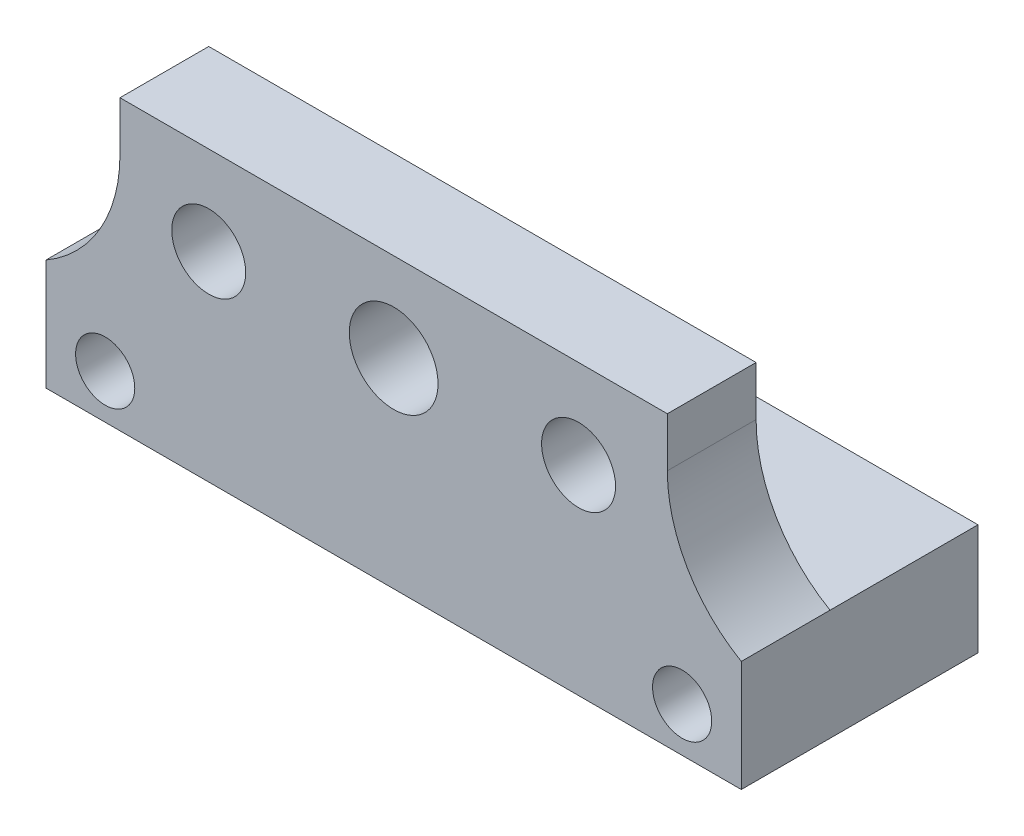
ISO-10303-21;
HEADER;
FILE_DESCRIPTION(('STEP AP214'),'2;1');
FILE_NAME('part.step','',(''),(''),'','','');
FILE_SCHEMA(('AUTOMOTIVE_DESIGN { 1 0 10303 214 1 1 1 1 }'));
ENDSEC;
DATA;
#1=APPLICATION_CONTEXT('core data for automotive mechanical design processes');
#2=APPLICATION_PROTOCOL_DEFINITION('international standard','automotive_design',2000,#1);
#3=PRODUCT_CONTEXT('',#1,'mechanical');
#4=PRODUCT('Part','Part','',(#3));
#5=PRODUCT_RELATED_PRODUCT_CATEGORY('part','',(#4));
#6=PRODUCT_DEFINITION_FORMATION('','',#4);
#7=PRODUCT_DEFINITION_CONTEXT('part definition',#1,'design');
#8=PRODUCT_DEFINITION('design','',#6,#7);
#9=PRODUCT_DEFINITION_SHAPE('','',#8);
#10=(LENGTH_UNIT() NAMED_UNIT(*) SI_UNIT(.MILLI.,.METRE.));
#11=(NAMED_UNIT(*) PLANE_ANGLE_UNIT() SI_UNIT($,.RADIAN.));
#12=(NAMED_UNIT(*) SI_UNIT($,.STERADIAN.) SOLID_ANGLE_UNIT());
#13=UNCERTAINTY_MEASURE_WITH_UNIT(LENGTH_MEASURE(1.E-05),#10,'distance_accuracy_value','');
#14=(GEOMETRIC_REPRESENTATION_CONTEXT(3) GLOBAL_UNCERTAINTY_ASSIGNED_CONTEXT((#13)) GLOBAL_UNIT_ASSIGNED_CONTEXT((#10,
#11,#12)) REPRESENTATION_CONTEXT('',''));
#15=CARTESIAN_POINT('',(0.,0.,0.));
#16=DIRECTION('',(0.,0.,1.));
#17=DIRECTION('',(1.,0.,0.));
#18=AXIS2_PLACEMENT_3D('',#15,#16,#17);
#19=CARTESIAN_POINT('',(0.,0.,0.));
#20=DIRECTION('',(0.,0.,1.));
#21=DIRECTION('',(1.,0.,0.));
#22=AXIS2_PLACEMENT_3D('',#19,#20,#21);
#23=PLANE('',#22);
#24=CARTESIAN_POINT('',(3.7,1.2,0.));
#25=DIRECTION('',(0.,0.,1.));
#26=DIRECTION('',(1.,0.,0.));
#27=AXIS2_PLACEMENT_3D('',#24,#25,#26);
#28=CIRCLE('',#27,0.599999999999999);
#29=CARTESIAN_POINT('',(4.3,1.2,0.));
#30=VERTEX_POINT('',#29);
#31=EDGE_CURVE('E322',#30,#30,#28,.T.);
#32=ORIENTED_EDGE('',*,*,#31,.T.);
#33=EDGE_LOOP('',(#32));
#34=FACE_BOUND('',#33,.T.);
#35=CARTESIAN_POINT('',(1.2,1.2,0.));
#36=DIRECTION('',(0.,0.,1.));
#37=DIRECTION('',(1.,0.,0.));
#38=AXIS2_PLACEMENT_3D('',#35,#36,#37);
#39=CIRCLE('',#38,0.3);
#40=CARTESIAN_POINT('',(1.5,1.2,0.));
#41=VERTEX_POINT('',#40);
#42=EDGE_CURVE('E162',#41,#41,#39,.T.);
#43=ORIENTED_EDGE('',*,*,#42,.T.);
#44=EDGE_LOOP('',(#43));
#45=FACE_BOUND('',#44,.T.);
#46=CARTESIAN_POINT('',(6.2,1.2,0.));
#47=DIRECTION('',(0.,0.,1.));
#48=DIRECTION('',(1.,0.,0.));
#49=AXIS2_PLACEMENT_3D('',#46,#47,#48);
#50=CIRCLE('',#49,0.3);
#51=CARTESIAN_POINT('',(6.5,1.2,0.));
#52=VERTEX_POINT('',#51);
#53=EDGE_CURVE('E150',#52,#52,#50,.T.);
#54=ORIENTED_EDGE('',*,*,#53,.T.);
#55=EDGE_LOOP('',(#54));
#56=FACE_BOUND('',#55,.T.);
#57=DIRECTION('',(1.,0.,0.));
#58=VECTOR('',#57,1.);
#59=CARTESIAN_POINT('',(8.4,0.,0.));
#60=LINE('',#59,#58);
#61=CARTESIAN_POINT('',(-0.999999999999996,0.,0.));
#62=VERTEX_POINT('',#61);
#63=CARTESIAN_POINT('',(8.4,0.,0.));
#64=VERTEX_POINT('',#63);
#65=EDGE_CURVE('E187',#62,#64,#60,.T.);
#66=ORIENTED_EDGE('',*,*,#65,.F.);
#67=CARTESIAN_POINT('',(-2.,1.73205080756887,0.));
#68=DIRECTION('',(0.,0.,1.));
#69=DIRECTION('',(1.,0.,0.));
#70=AXIS2_PLACEMENT_3D('',#67,#68,#69);
#71=CIRCLE('',#70,2.);
#72=CARTESIAN_POINT('',(0.,1.73205080756887,0.));
#73=VERTEX_POINT('',#72);
#74=EDGE_CURVE('E210',#62,#73,#71,.T.);
#75=ORIENTED_EDGE('',*,*,#74,.T.);
#76=DIRECTION('',(0.,-1.,0.));
#77=VECTOR('',#76,1.);
#78=CARTESIAN_POINT('',(0.,0.,0.));
#79=LINE('',#78,#77);
#80=CARTESIAN_POINT('',(0.,2.4,0.));
#81=VERTEX_POINT('',#80);
#82=EDGE_CURVE('E184',#81,#73,#79,.T.);
#83=ORIENTED_EDGE('',*,*,#82,.F.);
#84=DIRECTION('',(-1.,0.,0.));
#85=VECTOR('',#84,1.);
#86=CARTESIAN_POINT('',(0.,2.4,0.));
#87=LINE('',#86,#85);
#88=CARTESIAN_POINT('',(7.4,2.4,0.));
#89=VERTEX_POINT('',#88);
#90=EDGE_CURVE('E166',#89,#81,#87,.T.);
#91=ORIENTED_EDGE('',*,*,#90,.F.);
#92=DIRECTION('',(0.,1.,0.));
#93=VECTOR('',#92,1.);
#94=CARTESIAN_POINT('',(7.4,0.,0.));
#95=LINE('',#94,#93);
#96=CARTESIAN_POINT('',(7.4,1.73205080756888,0.));
#97=VERTEX_POINT('',#96);
#98=EDGE_CURVE('E170',#97,#89,#95,.T.);
#99=ORIENTED_EDGE('',*,*,#98,.F.);
#100=CARTESIAN_POINT('',(9.4,1.73205080756888,0.));
#101=DIRECTION('',(0.,0.,1.));
#102=DIRECTION('',(1.,0.,0.));
#103=AXIS2_PLACEMENT_3D('',#100,#101,#102);
#104=CIRCLE('',#103,2.);
#105=EDGE_CURVE('E11',#97,#64,#104,.T.);
#106=ORIENTED_EDGE('',*,*,#105,.T.);
#107=EDGE_LOOP('',(#66,#75,#83,#91,#99,#106));
#108=FACE_BOUND('',#107,.T.);
#109=ADVANCED_FACE('F36',(#34,#45,#56,#108),#23,.F.);
#110=CARTESIAN_POINT('',(0.,0.,0.));
#111=DIRECTION('',(-1.,0.,0.));
#112=DIRECTION('',(0.,-1.,0.));
#113=AXIS2_PLACEMENT_3D('',#110,#111,#112);
#114=PLANE('',#113);
#115=ORIENTED_EDGE('',*,*,#82,.T.);
#116=DIRECTION('',(0.,0.,1.));
#117=VECTOR('',#116,1.);
#118=CARTESIAN_POINT('',(0.,1.73205080756887,1.2));
#119=LINE('',#118,#117);
#120=CARTESIAN_POINT('',(0.,1.73205080756887,1.2));
#121=VERTEX_POINT('',#120);
#122=EDGE_CURVE('E200',#73,#121,#119,.T.);
#123=ORIENTED_EDGE('',*,*,#122,.T.);
#124=DIRECTION('',(0.,-1.,0.));
#125=VECTOR('',#124,1.);
#126=CARTESIAN_POINT('',(0.,0.,1.2));
#127=LINE('',#126,#125);
#128=CARTESIAN_POINT('',(0.,2.4,1.2));
#129=VERTEX_POINT('',#128);
#130=EDGE_CURVE('E165',#129,#121,#127,.T.);
#131=ORIENTED_EDGE('',*,*,#130,.F.);
#132=DIRECTION('',(0.,0.,1.));
#133=VECTOR('',#132,1.);
#134=CARTESIAN_POINT('',(0.,2.4,0.));
#135=LINE('',#134,#133);
#136=EDGE_CURVE('E185',#81,#129,#135,.T.);
#137=ORIENTED_EDGE('',*,*,#136,.F.);
#138=EDGE_LOOP('',(#115,#123,#131,#137));
#139=FACE_BOUND('',#138,.T.);
#140=ADVANCED_FACE('F222',(#139),#114,.T.);
#141=CARTESIAN_POINT('',(0.,2.4,0.));
#142=DIRECTION('',(0.,1.,0.));
#143=DIRECTION('',(0.,0.,1.));
#144=AXIS2_PLACEMENT_3D('',#141,#142,#143);
#145=PLANE('',#144);
#146=DIRECTION('',(-1.,0.,0.));
#147=VECTOR('',#146,1.);
#148=CARTESIAN_POINT('',(0.,2.4,1.2));
#149=LINE('',#148,#147);
#150=CARTESIAN_POINT('',(7.4,2.4,1.2));
#151=VERTEX_POINT('',#150);
#152=EDGE_CURVE('E181',#151,#129,#149,.T.);
#153=ORIENTED_EDGE('',*,*,#152,.F.);
#154=DIRECTION('',(0.,0.,1.));
#155=VECTOR('',#154,1.);
#156=CARTESIAN_POINT('',(7.4,2.4,0.));
#157=LINE('',#156,#155);
#158=EDGE_CURVE('E188',#89,#151,#157,.T.);
#159=ORIENTED_EDGE('',*,*,#158,.F.);
#160=ORIENTED_EDGE('',*,*,#90,.T.);
#161=ORIENTED_EDGE('',*,*,#136,.T.);
#162=EDGE_LOOP('',(#153,#159,#160,#161));
#163=FACE_BOUND('',#162,.T.);
#164=ADVANCED_FACE('F238',(#163),#145,.T.);
#165=CARTESIAN_POINT('',(7.4,0.,0.));
#166=DIRECTION('',(1.,0.,0.));
#167=DIRECTION('',(0.,0.,-1.));
#168=AXIS2_PLACEMENT_3D('',#165,#166,#167);
#169=PLANE('',#168);
#170=DIRECTION('',(0.,1.,0.));
#171=VECTOR('',#170,1.);
#172=CARTESIAN_POINT('',(7.4,0.,1.2));
#173=LINE('',#172,#171);
#174=CARTESIAN_POINT('',(7.4,1.73205080756888,1.2));
#175=VERTEX_POINT('',#174);
#176=EDGE_CURVE('E179',#175,#151,#173,.T.);
#177=ORIENTED_EDGE('',*,*,#176,.F.);
#178=DIRECTION('',(0.,0.,1.));
#179=VECTOR('',#178,1.);
#180=CARTESIAN_POINT('',(7.4,1.73205080756888,0.));
#181=LINE('',#180,#179);
#182=EDGE_CURVE('E51',#175,#97,#181,.F.);
#183=ORIENTED_EDGE('',*,*,#182,.T.);
#184=ORIENTED_EDGE('',*,*,#98,.T.);
#185=ORIENTED_EDGE('',*,*,#158,.T.);
#186=EDGE_LOOP('',(#177,#183,#184,#185));
#187=FACE_BOUND('',#186,.T.);
#188=ADVANCED_FACE('F235',(#187),#169,.T.);
#189=CARTESIAN_POINT('',(0.,0.,0.));
#190=DIRECTION('',(0.,-1.,0.));
#191=DIRECTION('',(1.,0.,0.));
#192=AXIS2_PLACEMENT_3D('',#189,#190,#191);
#193=PLANE('',#192);
#194=DIRECTION('',(0.,0.,1.));
#195=VECTOR('',#194,1.);
#196=CARTESIAN_POINT('',(-0.999999999999996,0.,0.));
#197=LINE('',#196,#195);
#198=CARTESIAN_POINT('',(-0.999999999999996,0.,-2.));
#199=VERTEX_POINT('',#198);
#200=EDGE_CURVE('E194',#199,#62,#197,.T.);
#201=ORIENTED_EDGE('',*,*,#200,.T.);
#202=ORIENTED_EDGE('',*,*,#65,.T.);
#203=DIRECTION('',(0.,0.,1.));
#204=VECTOR('',#203,1.);
#205=CARTESIAN_POINT('',(8.4,0.,0.));
#206=LINE('',#205,#204);
#207=CARTESIAN_POINT('',(8.4,0.,-2.));
#208=VERTEX_POINT('',#207);
#209=EDGE_CURVE('E191',#208,#64,#206,.T.);
#210=ORIENTED_EDGE('',*,*,#209,.F.);
#211=DIRECTION('',(1.,0.,0.));
#212=VECTOR('',#211,1.);
#213=CARTESIAN_POINT('',(8.4,0.,-2.));
#214=LINE('',#213,#212);
#215=EDGE_CURVE('E131',#199,#208,#214,.T.);
#216=ORIENTED_EDGE('',*,*,#215,.F.);
#217=EDGE_LOOP('',(#201,#202,#210,#216));
#218=FACE_BOUND('',#217,.T.);
#219=ADVANCED_FACE('F230',(#218),#193,.F.);
#220=CARTESIAN_POINT('',(8.4,0.,0.));
#221=DIRECTION('',(-1.,0.,0.));
#222=DIRECTION('',(0.,0.,1.));
#223=AXIS2_PLACEMENT_3D('',#220,#221,#222);
#224=PLANE('',#223);
#225=DIRECTION('',(0.,-1.,0.));
#226=VECTOR('',#225,1.);
#227=CARTESIAN_POINT('',(8.4,0.,1.2));
#228=LINE('',#227,#226);
#229=CARTESIAN_POINT('',(8.4,0.,1.2));
#230=VERTEX_POINT('',#229);
#231=CARTESIAN_POINT('',(8.4,-1.5,1.2));
#232=VERTEX_POINT('',#231);
#233=EDGE_CURVE('E113',#230,#232,#228,.T.);
#234=ORIENTED_EDGE('',*,*,#233,.T.);
#235=DIRECTION('',(0.,0.,1.));
#236=VECTOR('',#235,1.);
#237=CARTESIAN_POINT('',(8.4,-1.5,0.));
#238=LINE('',#237,#236);
#239=CARTESIAN_POINT('',(8.4,-1.5,-2.));
#240=VERTEX_POINT('',#239);
#241=EDGE_CURVE('E106',#240,#232,#238,.T.);
#242=ORIENTED_EDGE('',*,*,#241,.F.);
#243=DIRECTION('',(0.,-1.,0.));
#244=VECTOR('',#243,1.);
#245=CARTESIAN_POINT('',(8.4,0.,-2.));
#246=LINE('',#245,#244);
#247=EDGE_CURVE('E111',#208,#240,#246,.T.);
#248=ORIENTED_EDGE('',*,*,#247,.F.);
#249=ORIENTED_EDGE('',*,*,#209,.T.);
#250=EDGE_CURVE('E117',#64,#230,#206,.T.);
#251=ORIENTED_EDGE('',*,*,#250,.T.);
#252=EDGE_LOOP('',(#234,#242,#248,#249,#251));
#253=FACE_BOUND('',#252,.T.);
#254=ADVANCED_FACE('F108',(#253),#224,.F.);
#255=CARTESIAN_POINT('',(0.,-1.5,0.));
#256=DIRECTION('',(0.,-1.,0.));
#257=DIRECTION('',(1.,0.,0.));
#258=AXIS2_PLACEMENT_3D('',#255,#256,#257);
#259=PLANE('',#258);
#260=DIRECTION('',(1.,0.,0.));
#261=VECTOR('',#260,1.);
#262=CARTESIAN_POINT('',(0.,-1.5,1.2));
#263=LINE('',#262,#261);
#264=CARTESIAN_POINT('',(-0.999999999999996,-1.5,1.2));
#265=VERTEX_POINT('',#264);
#266=EDGE_CURVE('E176',#265,#232,#263,.T.);
#267=ORIENTED_EDGE('',*,*,#266,.F.);
#268=DIRECTION('',(0.,0.,1.));
#269=VECTOR('',#268,1.);
#270=CARTESIAN_POINT('',(-0.999999999999996,-1.5,0.));
#271=LINE('',#270,#269);
#272=CARTESIAN_POINT('',(-0.999999999999996,-1.5,-2.));
#273=VERTEX_POINT('',#272);
#274=EDGE_CURVE('E118',#273,#265,#271,.T.);
#275=ORIENTED_EDGE('',*,*,#274,.F.);
#276=DIRECTION('',(-1.,0.,0.));
#277=VECTOR('',#276,1.);
#278=CARTESIAN_POINT('',(8.4,-1.5,-2.));
#279=LINE('',#278,#277);
#280=EDGE_CURVE('E121',#240,#273,#279,.T.);
#281=ORIENTED_EDGE('',*,*,#280,.F.);
#282=ORIENTED_EDGE('',*,*,#241,.T.);
#283=EDGE_LOOP('',(#267,#275,#281,#282));
#284=FACE_BOUND('',#283,.T.);
#285=ADVANCED_FACE('F122',(#284),#259,.T.);
#286=CARTESIAN_POINT('',(-0.999999999999996,0.,0.));
#287=DIRECTION('',(-1.,0.,0.));
#288=DIRECTION('',(0.,-1.,0.));
#289=AXIS2_PLACEMENT_3D('',#286,#287,#288);
#290=PLANE('',#289);
#291=DIRECTION('',(0.,-1.,0.));
#292=VECTOR('',#291,1.);
#293=CARTESIAN_POINT('',(-0.999999999999996,0.,1.2));
#294=LINE('',#293,#292);
#295=CARTESIAN_POINT('',(-0.999999999999996,0.,1.2));
#296=VERTEX_POINT('',#295);
#297=EDGE_CURVE('E173',#296,#265,#294,.T.);
#298=ORIENTED_EDGE('',*,*,#297,.F.);
#299=EDGE_CURVE('E169',#62,#296,#197,.T.);
#300=ORIENTED_EDGE('',*,*,#299,.F.);
#301=ORIENTED_EDGE('',*,*,#200,.F.);
#302=DIRECTION('',(0.,1.,0.));
#303=VECTOR('',#302,1.);
#304=CARTESIAN_POINT('',(-0.999999999999996,0.,-2.));
#305=LINE('',#304,#303);
#306=EDGE_CURVE('E126',#273,#199,#305,.T.);
#307=ORIENTED_EDGE('',*,*,#306,.F.);
#308=ORIENTED_EDGE('',*,*,#274,.T.);
#309=EDGE_LOOP('',(#298,#300,#301,#307,#308));
#310=FACE_BOUND('',#309,.T.);
#311=ADVANCED_FACE('F228',(#310),#290,.T.);
#312=CARTESIAN_POINT('',(0.,0.,1.2));
#313=DIRECTION('',(0.,0.,1.));
#314=DIRECTION('',(1.,0.,0.));
#315=AXIS2_PLACEMENT_3D('',#312,#313,#314);
#316=PLANE('',#315);
#317=CARTESIAN_POINT('',(3.7,1.2,1.2));
#318=DIRECTION('',(0.,0.,1.));
#319=DIRECTION('',(1.,0.,0.));
#320=AXIS2_PLACEMENT_3D('',#317,#318,#319);
#321=CIRCLE('',#320,0.599999999999999);
#322=CARTESIAN_POINT('',(4.3,1.2,1.2));
#323=VERTEX_POINT('',#322);
#324=EDGE_CURVE('E270',#323,#323,#321,.T.);
#325=ORIENTED_EDGE('',*,*,#324,.F.);
#326=EDGE_LOOP('',(#325));
#327=FACE_BOUND('',#326,.T.);
#328=CARTESIAN_POINT('',(-0.199999999999995,-0.9,1.2));
#329=DIRECTION('',(0.,0.,1.));
#330=DIRECTION('',(1.,0.,0.));
#331=AXIS2_PLACEMENT_3D('',#328,#329,#330);
#332=CIRCLE('',#331,0.4);
#333=CARTESIAN_POINT('',(0.200000000000004,-0.9,1.2));
#334=VERTEX_POINT('',#333);
#335=EDGE_CURVE('E274',#334,#334,#332,.T.);
#336=ORIENTED_EDGE('',*,*,#335,.F.);
#337=EDGE_LOOP('',(#336));
#338=FACE_BOUND('',#337,.T.);
#339=CARTESIAN_POINT('',(7.6,-0.9,1.2));
#340=DIRECTION('',(0.,0.,1.));
#341=DIRECTION('',(1.,0.,0.));
#342=AXIS2_PLACEMENT_3D('',#339,#340,#341);
#343=CIRCLE('',#342,0.399999999999999);
#344=CARTESIAN_POINT('',(8.,-0.9,1.2));
#345=VERTEX_POINT('',#344);
#346=EDGE_CURVE('E135',#345,#345,#343,.T.);
#347=ORIENTED_EDGE('',*,*,#346,.F.);
#348=EDGE_LOOP('',(#347));
#349=FACE_BOUND('',#348,.T.);
#350=CARTESIAN_POINT('',(6.2,1.2,1.2));
#351=DIRECTION('',(0.,0.,1.));
#352=DIRECTION('',(1.,0.,0.));
#353=AXIS2_PLACEMENT_3D('',#350,#351,#352);
#354=CIRCLE('',#353,0.500000000000004);
#355=CARTESIAN_POINT('',(6.7,1.2,1.2));
#356=VERTEX_POINT('',#355);
#357=EDGE_CURVE('E141',#356,#356,#354,.T.);
#358=ORIENTED_EDGE('',*,*,#357,.F.);
#359=EDGE_LOOP('',(#358));
#360=FACE_BOUND('',#359,.T.);
#361=CARTESIAN_POINT('',(1.2,1.2,1.2));
#362=DIRECTION('',(0.,0.,1.));
#363=DIRECTION('',(1.,0.,0.));
#364=AXIS2_PLACEMENT_3D('',#361,#362,#363);
#365=CIRCLE('',#364,0.500000000000004);
#366=CARTESIAN_POINT('',(1.7,1.2,1.2));
#367=VERTEX_POINT('',#366);
#368=EDGE_CURVE('E153',#367,#367,#365,.T.);
#369=ORIENTED_EDGE('',*,*,#368,.F.);
#370=EDGE_LOOP('',(#369));
#371=FACE_BOUND('',#370,.T.);
#372=ORIENTED_EDGE('',*,*,#130,.T.);
#373=CARTESIAN_POINT('',(-2.,1.73205080756887,1.2));
#374=DIRECTION('',(0.,0.,1.));
#375=DIRECTION('',(1.,0.,0.));
#376=AXIS2_PLACEMENT_3D('',#373,#374,#375);
#377=CIRCLE('',#376,2.);
#378=EDGE_CURVE('E208',#121,#296,#377,.F.);
#379=ORIENTED_EDGE('',*,*,#378,.T.);
#380=ORIENTED_EDGE('',*,*,#297,.T.);
#381=ORIENTED_EDGE('',*,*,#266,.T.);
#382=ORIENTED_EDGE('',*,*,#233,.F.);
#383=CARTESIAN_POINT('',(9.4,1.73205080756888,1.2));
#384=DIRECTION('',(0.,0.,1.));
#385=DIRECTION('',(1.,0.,0.));
#386=AXIS2_PLACEMENT_3D('',#383,#384,#385);
#387=CIRCLE('',#386,2.);
#388=EDGE_CURVE('E44',#230,#175,#387,.F.);
#389=ORIENTED_EDGE('',*,*,#388,.T.);
#390=ORIENTED_EDGE('',*,*,#176,.T.);
#391=ORIENTED_EDGE('',*,*,#152,.T.);
#392=EDGE_LOOP('',(#372,#379,#380,#381,#382,#389,#390,#391));
#393=FACE_BOUND('',#392,.T.);
#394=ADVANCED_FACE('F226',(#327,#338,#349,#360,#371,#393),#316,.T.);
#395=CARTESIAN_POINT('',(1.2,1.2,1.2));
#396=DIRECTION('',(0.,0.,1.));
#397=DIRECTION('',(1.,0.,0.));
#398=AXIS2_PLACEMENT_3D('',#395,#396,#397);
#399=CYLINDRICAL_SURFACE('',#398,0.3);
#400=ORIENTED_EDGE('',*,*,#42,.F.);
#401=EDGE_LOOP('',(#400));
#402=FACE_BOUND('',#401,.T.);
#403=CARTESIAN_POINT('',(1.2,1.2,0.3));
#404=DIRECTION('',(0.,0.,1.));
#405=DIRECTION('',(1.,0.,0.));
#406=AXIS2_PLACEMENT_3D('',#403,#404,#405);
#407=CIRCLE('',#406,0.3);
#408=CARTESIAN_POINT('',(1.5,1.2,0.3));
#409=VERTEX_POINT('',#408);
#410=EDGE_CURVE('E159',#409,#409,#407,.T.);
#411=ORIENTED_EDGE('',*,*,#410,.T.);
#412=EDGE_LOOP('',(#411));
#413=FACE_BOUND('',#412,.T.);
#414=ADVANCED_FACE('F256',(#402,#413),#399,.F.);
#415=CARTESIAN_POINT('',(1.5,1.2,0.3));
#416=DIRECTION('',(0.,0.,-1.));
#417=DIRECTION('',(-1.,0.,0.));
#418=AXIS2_PLACEMENT_3D('',#415,#416,#417);
#419=PLANE('',#418);
#420=ORIENTED_EDGE('',*,*,#410,.F.);
#421=EDGE_LOOP('',(#420));
#422=FACE_BOUND('',#421,.T.);
#423=CARTESIAN_POINT('',(1.2,1.2,0.3));
#424=DIRECTION('',(0.,0.,1.));
#425=DIRECTION('',(1.,0.,0.));
#426=AXIS2_PLACEMENT_3D('',#423,#424,#425);
#427=CIRCLE('',#426,0.5);
#428=CARTESIAN_POINT('',(1.7,1.2,0.3));
#429=VERTEX_POINT('',#428);
#430=EDGE_CURVE('E156',#429,#429,#427,.T.);
#431=ORIENTED_EDGE('',*,*,#430,.T.);
#432=EDGE_LOOP('',(#431));
#433=FACE_BOUND('',#432,.T.);
#434=ADVANCED_FACE('F264',(#422,#433),#419,.F.);
#435=CARTESIAN_POINT('',(1.2,1.2,1.2));
#436=DIRECTION('',(0.,0.,1.));
#437=DIRECTION('',(1.,0.,0.));
#438=AXIS2_PLACEMENT_3D('',#435,#436,#437);
#439=CYLINDRICAL_SURFACE('',#438,0.500000000000002);
#440=ORIENTED_EDGE('',*,*,#430,.F.);
#441=EDGE_LOOP('',(#440));
#442=FACE_BOUND('',#441,.T.);
#443=ORIENTED_EDGE('',*,*,#368,.T.);
#444=EDGE_LOOP('',(#443));
#445=FACE_BOUND('',#444,.T.);
#446=ADVANCED_FACE('F282',(#442,#445),#439,.F.);
#447=CARTESIAN_POINT('',(6.2,1.2,1.2));
#448=DIRECTION('',(0.,0.,1.));
#449=DIRECTION('',(1.,0.,0.));
#450=AXIS2_PLACEMENT_3D('',#447,#448,#449);
#451=CYLINDRICAL_SURFACE('',#450,0.3);
#452=ORIENTED_EDGE('',*,*,#53,.F.);
#453=EDGE_LOOP('',(#452));
#454=FACE_BOUND('',#453,.T.);
#455=CARTESIAN_POINT('',(6.2,1.2,0.3));
#456=DIRECTION('',(0.,0.,1.));
#457=DIRECTION('',(1.,0.,0.));
#458=AXIS2_PLACEMENT_3D('',#455,#456,#457);
#459=CIRCLE('',#458,0.3);
#460=CARTESIAN_POINT('',(6.5,1.2,0.3));
#461=VERTEX_POINT('',#460);
#462=EDGE_CURVE('E147',#461,#461,#459,.T.);
#463=ORIENTED_EDGE('',*,*,#462,.T.);
#464=EDGE_LOOP('',(#463));
#465=FACE_BOUND('',#464,.T.);
#466=ADVANCED_FACE('F284',(#454,#465),#451,.F.);
#467=CARTESIAN_POINT('',(6.5,1.2,0.3));
#468=DIRECTION('',(0.,0.,-1.));
#469=DIRECTION('',(-1.,0.,0.));
#470=AXIS2_PLACEMENT_3D('',#467,#468,#469);
#471=PLANE('',#470);
#472=ORIENTED_EDGE('',*,*,#462,.F.);
#473=EDGE_LOOP('',(#472));
#474=FACE_BOUND('',#473,.T.);
#475=CARTESIAN_POINT('',(6.2,1.2,0.3));
#476=DIRECTION('',(0.,0.,1.));
#477=DIRECTION('',(1.,0.,0.));
#478=AXIS2_PLACEMENT_3D('',#475,#476,#477);
#479=CIRCLE('',#478,0.5);
#480=CARTESIAN_POINT('',(6.7,1.2,0.3));
#481=VERTEX_POINT('',#480);
#482=EDGE_CURVE('E144',#481,#481,#479,.T.);
#483=ORIENTED_EDGE('',*,*,#482,.T.);
#484=EDGE_LOOP('',(#483));
#485=FACE_BOUND('',#484,.T.);
#486=ADVANCED_FACE('F291',(#474,#485),#471,.F.);
#487=CARTESIAN_POINT('',(6.2,1.2,1.2));
#488=DIRECTION('',(0.,0.,1.));
#489=DIRECTION('',(1.,0.,0.));
#490=AXIS2_PLACEMENT_3D('',#487,#488,#489);
#491=CYLINDRICAL_SURFACE('',#490,0.500000000000002);
#492=ORIENTED_EDGE('',*,*,#482,.F.);
#493=EDGE_LOOP('',(#492));
#494=FACE_BOUND('',#493,.T.);
#495=ORIENTED_EDGE('',*,*,#357,.T.);
#496=EDGE_LOOP('',(#495));
#497=FACE_BOUND('',#496,.T.);
#498=ADVANCED_FACE('F299',(#494,#497),#491,.F.);
#499=CARTESIAN_POINT('',(0.,0.,-2.));
#500=DIRECTION('',(0.,0.,-1.));
#501=DIRECTION('',(-1.,0.,0.));
#502=AXIS2_PLACEMENT_3D('',#499,#500,#501);
#503=PLANE('',#502);
#504=CARTESIAN_POINT('',(-0.199999999999995,-0.9,-2.));
#505=DIRECTION('',(0.,0.,1.));
#506=DIRECTION('',(1.,0.,0.));
#507=AXIS2_PLACEMENT_3D('',#504,#505,#506);
#508=CIRCLE('',#507,0.399999999999999);
#509=CARTESIAN_POINT('',(0.200000000000004,-0.9,-2.));
#510=VERTEX_POINT('',#509);
#511=EDGE_CURVE('E327',#510,#510,#508,.T.);
#512=ORIENTED_EDGE('',*,*,#511,.T.);
#513=EDGE_LOOP('',(#512));
#514=FACE_BOUND('',#513,.T.);
#515=CARTESIAN_POINT('',(7.6,-0.9,-2.));
#516=DIRECTION('',(0.,0.,1.));
#517=DIRECTION('',(1.,0.,0.));
#518=AXIS2_PLACEMENT_3D('',#515,#516,#517);
#519=CIRCLE('',#518,0.399999999999999);
#520=CARTESIAN_POINT('',(8.,-0.9,-2.));
#521=VERTEX_POINT('',#520);
#522=EDGE_CURVE('E132',#521,#521,#519,.T.);
#523=ORIENTED_EDGE('',*,*,#522,.T.);
#524=EDGE_LOOP('',(#523));
#525=FACE_BOUND('',#524,.T.);
#526=ORIENTED_EDGE('',*,*,#247,.T.);
#527=ORIENTED_EDGE('',*,*,#280,.T.);
#528=ORIENTED_EDGE('',*,*,#306,.T.);
#529=ORIENTED_EDGE('',*,*,#215,.T.);
#530=EDGE_LOOP('',(#526,#527,#528,#529));
#531=FACE_BOUND('',#530,.T.);
#532=ADVANCED_FACE('F129',(#514,#525,#531),#503,.T.);
#533=CARTESIAN_POINT('',(-2.,1.73205080756887,0.));
#534=DIRECTION('',(0.,0.,-1.));
#535=DIRECTION('',(-1.,0.,0.));
#536=AXIS2_PLACEMENT_3D('',#533,#534,#535);
#537=CYLINDRICAL_SURFACE('',#536,2.);
#538=ORIENTED_EDGE('',*,*,#74,.F.);
#539=ORIENTED_EDGE('',*,*,#299,.T.);
#540=ORIENTED_EDGE('',*,*,#378,.F.);
#541=ORIENTED_EDGE('',*,*,#122,.F.);
#542=EDGE_LOOP('',(#538,#539,#540,#541));
#543=FACE_BOUND('',#542,.T.);
#544=ADVANCED_FACE('F224',(#543),#537,.F.);
#545=CARTESIAN_POINT('',(9.4,1.73205080756888,0.));
#546=DIRECTION('',(0.,0.,-1.));
#547=DIRECTION('',(-1.,0.,0.));
#548=AXIS2_PLACEMENT_3D('',#545,#546,#547);
#549=CYLINDRICAL_SURFACE('',#548,2.);
#550=ORIENTED_EDGE('',*,*,#105,.F.);
#551=ORIENTED_EDGE('',*,*,#182,.F.);
#552=ORIENTED_EDGE('',*,*,#388,.F.);
#553=ORIENTED_EDGE('',*,*,#250,.F.);
#554=EDGE_LOOP('',(#550,#551,#552,#553));
#555=FACE_BOUND('',#554,.T.);
#556=ADVANCED_FACE('F38',(#555),#549,.F.);
#557=CARTESIAN_POINT('',(7.6,-0.9,1.2));
#558=DIRECTION('',(0.,0.,1.));
#559=DIRECTION('',(1.,0.,0.));
#560=AXIS2_PLACEMENT_3D('',#557,#558,#559);
#561=CYLINDRICAL_SURFACE('',#560,0.399999999999999);
#562=ORIENTED_EDGE('',*,*,#522,.F.);
#563=EDGE_LOOP('',(#562));
#564=FACE_BOUND('',#563,.T.);
#565=ORIENTED_EDGE('',*,*,#346,.T.);
#566=EDGE_LOOP('',(#565));
#567=FACE_BOUND('',#566,.T.);
#568=ADVANCED_FACE('F307',(#564,#567),#561,.F.);
#569=CARTESIAN_POINT('',(-0.199999999999995,-0.9,1.2));
#570=DIRECTION('',(0.,0.,1.));
#571=DIRECTION('',(1.,0.,0.));
#572=AXIS2_PLACEMENT_3D('',#569,#570,#571);
#573=CYLINDRICAL_SURFACE('',#572,0.399999999999999);
#574=ORIENTED_EDGE('',*,*,#511,.F.);
#575=EDGE_LOOP('',(#574));
#576=FACE_BOUND('',#575,.T.);
#577=ORIENTED_EDGE('',*,*,#335,.T.);
#578=EDGE_LOOP('',(#577));
#579=FACE_BOUND('',#578,.T.);
#580=ADVANCED_FACE('F310',(#576,#579),#573,.F.);
#581=CARTESIAN_POINT('',(3.7,1.2,1.2));
#582=DIRECTION('',(0.,0.,1.));
#583=DIRECTION('',(1.,0.,0.));
#584=AXIS2_PLACEMENT_3D('',#581,#582,#583);
#585=CYLINDRICAL_SURFACE('',#584,0.599999999999999);
#586=ORIENTED_EDGE('',*,*,#31,.F.);
#587=EDGE_LOOP('',(#586));
#588=FACE_BOUND('',#587,.T.);
#589=ORIENTED_EDGE('',*,*,#324,.T.);
#590=EDGE_LOOP('',(#589));
#591=FACE_BOUND('',#590,.T.);
#592=ADVANCED_FACE('F314',(#588,#591),#585,.F.);
#593=CLOSED_SHELL('',(#109,#140,#164,#188,#219,#254,#285,#311,#394,#414,#434,#446,#466,#486,
#498,#532,#544,#556,#568,#580,#592));
#594=MANIFOLD_SOLID_BREP('B2',#593);
#595=ADVANCED_BREP_SHAPE_REPRESENTATION('',(#18,#594),#14);
#596=SHAPE_DEFINITION_REPRESENTATION(#9,#595);
ENDSEC;
END-ISO-10303-21;
